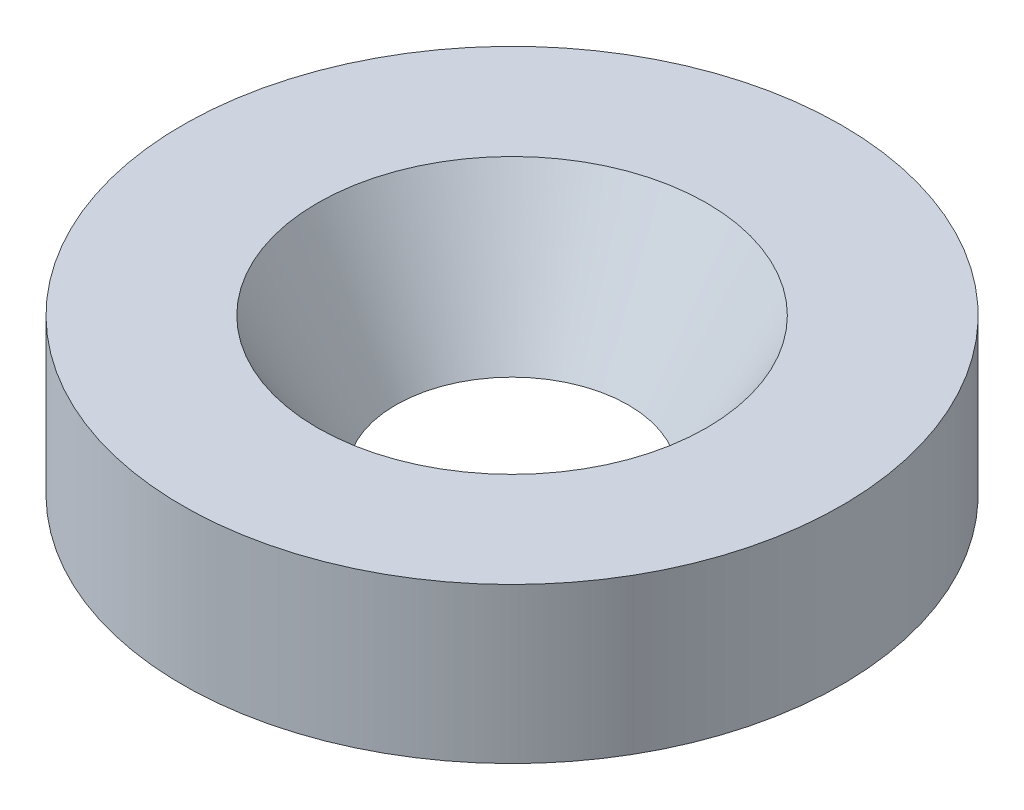
ISO-10303-21;
HEADER;
FILE_DESCRIPTION(('STEP AP214'),'2;1');
FILE_NAME('part.step','',(''),(''),'','','');
FILE_SCHEMA(('AUTOMOTIVE_DESIGN { 1 0 10303 214 1 1 1 1 }'));
ENDSEC;
DATA;
#1=APPLICATION_CONTEXT('core data for automotive mechanical design processes');
#2=APPLICATION_PROTOCOL_DEFINITION('international standard','automotive_design',2000,#1);
#3=PRODUCT_CONTEXT('',#1,'mechanical');
#4=PRODUCT('Part','Part','',(#3));
#5=PRODUCT_RELATED_PRODUCT_CATEGORY('part','',(#4));
#6=PRODUCT_DEFINITION_FORMATION('','',#4);
#7=PRODUCT_DEFINITION_CONTEXT('part definition',#1,'design');
#8=PRODUCT_DEFINITION('design','',#6,#7);
#9=PRODUCT_DEFINITION_SHAPE('','',#8);
#10=(LENGTH_UNIT() NAMED_UNIT(*) SI_UNIT(.MILLI.,.METRE.));
#11=(NAMED_UNIT(*) PLANE_ANGLE_UNIT() SI_UNIT($,.RADIAN.));
#12=(NAMED_UNIT(*) SI_UNIT($,.STERADIAN.) SOLID_ANGLE_UNIT());
#13=UNCERTAINTY_MEASURE_WITH_UNIT(LENGTH_MEASURE(1.E-05),#10,'distance_accuracy_value','');
#14=(GEOMETRIC_REPRESENTATION_CONTEXT(3) GLOBAL_UNCERTAINTY_ASSIGNED_CONTEXT((#13)) GLOBAL_UNIT_ASSIGNED_CONTEXT((#10,
#11,#12)) REPRESENTATION_CONTEXT('',''));
#15=CARTESIAN_POINT('',(0.,0.,0.));
#16=DIRECTION('',(0.,0.,1.));
#17=DIRECTION('',(1.,0.,0.));
#18=AXIS2_PLACEMENT_3D('',#15,#16,#17);
#19=CARTESIAN_POINT('',(0.,4.,-8.5));
#20=DIRECTION('',(0.,1.,0.));
#21=DIRECTION('',(0.,0.,1.));
#22=AXIS2_PLACEMENT_3D('',#19,#20,#21);
#23=PLANE('',#22);
#24=CARTESIAN_POINT('',(0.,4.,0.));
#25=DIRECTION('',(0.,-1.,0.));
#26=DIRECTION('',(0.,0.,-1.));
#27=AXIS2_PLACEMENT_3D('',#24,#25,#26);
#28=CIRCLE('',#27,5.02072594216371);
#29=CARTESIAN_POINT('',(0.,4.,-5.02072594216371));
#30=VERTEX_POINT('',#29);
#31=EDGE_CURVE('E59',#30,#30,#28,.T.);
#32=ORIENTED_EDGE('',*,*,#31,.T.);
#33=EDGE_LOOP('',(#32));
#34=FACE_BOUND('',#33,.T.);
#35=CARTESIAN_POINT('',(0.,4.,0.));
#36=DIRECTION('',(0.,-1.,0.));
#37=DIRECTION('',(0.,0.,-1.));
#38=AXIS2_PLACEMENT_3D('',#35,#36,#37);
#39=CIRCLE('',#38,8.5);
#40=CARTESIAN_POINT('',(0.,4.,-8.5));
#41=VERTEX_POINT('',#40);
#42=EDGE_CURVE('E10',#41,#41,#39,.T.);
#43=ORIENTED_EDGE('',*,*,#42,.F.);
#44=EDGE_LOOP('',(#43));
#45=FACE_BOUND('',#44,.T.);
#46=ADVANCED_FACE('F31',(#34,#45),#23,.T.);
#47=CARTESIAN_POINT('',(0.,0.,0.));
#48=DIRECTION('',(0.,-1.,0.));
#49=DIRECTION('',(0.,0.,-1.));
#50=AXIS2_PLACEMENT_3D('',#47,#48,#49);
#51=CYLINDRICAL_SURFACE('',#50,8.5);
#52=ORIENTED_EDGE('',*,*,#42,.T.);
#53=EDGE_LOOP('',(#52));
#54=FACE_BOUND('',#53,.T.);
#55=CARTESIAN_POINT('',(0.,0.,0.));
#56=DIRECTION('',(0.,-1.,0.));
#57=DIRECTION('',(0.,0.,-1.));
#58=AXIS2_PLACEMENT_3D('',#55,#56,#57);
#59=CIRCLE('',#58,8.5);
#60=CARTESIAN_POINT('',(0.,0.,-8.5));
#61=VERTEX_POINT('',#60);
#62=EDGE_CURVE('E37',#61,#61,#59,.T.);
#63=ORIENTED_EDGE('',*,*,#62,.F.);
#64=EDGE_LOOP('',(#63));
#65=FACE_BOUND('',#64,.T.);
#66=ADVANCED_FACE('F77',(#54,#65),#51,.T.);
#67=CARTESIAN_POINT('',(0.,0.,-8.));
#68=DIRECTION('',(0.,-1.,0.));
#69=DIRECTION('',(0.,0.,-1.));
#70=AXIS2_PLACEMENT_3D('',#67,#68,#69);
#71=PLANE('',#70);
#72=ORIENTED_EDGE('',*,*,#62,.T.);
#73=EDGE_LOOP('',(#72));
#74=FACE_BOUND('',#73,.T.);
#75=CARTESIAN_POINT('',(0.,0.,0.));
#76=DIRECTION('',(0.,-1.,0.));
#77=DIRECTION('',(0.,0.,-1.));
#78=AXIS2_PLACEMENT_3D('',#75,#76,#77);
#79=CIRCLE('',#78,8.);
#80=CARTESIAN_POINT('',(0.,0.,-8.));
#81=VERTEX_POINT('',#80);
#82=EDGE_CURVE('E41',#81,#81,#79,.T.);
#83=ORIENTED_EDGE('',*,*,#82,.F.);
#84=EDGE_LOOP('',(#83));
#85=FACE_BOUND('',#84,.T.);
#86=ADVANCED_FACE('F81',(#74,#85),#71,.T.);
#87=CARTESIAN_POINT('',(0.,0.,0.));
#88=DIRECTION('',(0.,-1.,0.));
#89=DIRECTION('',(0.,0.,-1.));
#90=AXIS2_PLACEMENT_3D('',#87,#88,#89);
#91=CYLINDRICAL_SURFACE('',#90,8.);
#92=ORIENTED_EDGE('',*,*,#82,.T.);
#93=EDGE_LOOP('',(#92));
#94=FACE_BOUND('',#93,.T.);
#95=CARTESIAN_POINT('',(0.,2.75,0.));
#96=DIRECTION('',(0.,-1.,0.));
#97=DIRECTION('',(0.,0.,-1.));
#98=AXIS2_PLACEMENT_3D('',#95,#96,#97);
#99=CIRCLE('',#98,8.);
#100=CARTESIAN_POINT('',(0.,2.75,-8.));
#101=VERTEX_POINT('',#100);
#102=EDGE_CURVE('E45',#101,#101,#99,.T.);
#103=ORIENTED_EDGE('',*,*,#102,.F.);
#104=EDGE_LOOP('',(#103));
#105=FACE_BOUND('',#104,.T.);
#106=ADVANCED_FACE('F85',(#94,#105),#91,.F.);
#107=CARTESIAN_POINT('',(0.,2.75,-6.));
#108=DIRECTION('',(0.,-1.,0.));
#109=DIRECTION('',(0.,0.,-1.));
#110=AXIS2_PLACEMENT_3D('',#107,#108,#109);
#111=PLANE('',#110);
#112=ORIENTED_EDGE('',*,*,#102,.T.);
#113=EDGE_LOOP('',(#112));
#114=FACE_BOUND('',#113,.T.);
#115=CARTESIAN_POINT('',(0.,2.75,0.));
#116=DIRECTION('',(0.,-1.,0.));
#117=DIRECTION('',(0.,0.,-1.));
#118=AXIS2_PLACEMENT_3D('',#115,#116,#117);
#119=CIRCLE('',#118,6.);
#120=CARTESIAN_POINT('',(0.,2.75,-6.));
#121=VERTEX_POINT('',#120);
#122=EDGE_CURVE('E50',#121,#121,#119,.T.);
#123=ORIENTED_EDGE('',*,*,#122,.F.);
#124=EDGE_LOOP('',(#123));
#125=FACE_BOUND('',#124,.T.);
#126=ADVANCED_FACE('F91',(#114,#125),#111,.T.);
#127=CARTESIAN_POINT('',(0.,0.,0.));
#128=DIRECTION('',(0.,-1.,0.));
#129=DIRECTION('',(0.,0.,-1.));
#130=AXIS2_PLACEMENT_3D('',#127,#128,#129);
#131=CYLINDRICAL_SURFACE('',#130,6.);
#132=ORIENTED_EDGE('',*,*,#122,.T.);
#133=EDGE_LOOP('',(#132));
#134=FACE_BOUND('',#133,.T.);
#135=CARTESIAN_POINT('',(0.,0.5,0.));
#136=DIRECTION('',(0.,-1.,0.));
#137=DIRECTION('',(0.,0.,-1.));
#138=AXIS2_PLACEMENT_3D('',#135,#136,#137);
#139=CIRCLE('',#138,6.);
#140=CARTESIAN_POINT('',(0.,0.5,-6.));
#141=VERTEX_POINT('',#140);
#142=EDGE_CURVE('E53',#141,#141,#139,.T.);
#143=ORIENTED_EDGE('',*,*,#142,.F.);
#144=EDGE_LOOP('',(#143));
#145=FACE_BOUND('',#144,.T.);
#146=ADVANCED_FACE('F73',(#134,#145),#131,.T.);
#147=CARTESIAN_POINT('',(0.,0.5,-3.));
#148=DIRECTION('',(0.,-1.,0.));
#149=DIRECTION('',(0.,0.,-1.));
#150=AXIS2_PLACEMENT_3D('',#147,#148,#149);
#151=PLANE('',#150);
#152=ORIENTED_EDGE('',*,*,#142,.T.);
#153=EDGE_LOOP('',(#152));
#154=FACE_BOUND('',#153,.T.);
#155=CARTESIAN_POINT('',(0.,0.5,0.));
#156=DIRECTION('',(0.,-1.,0.));
#157=DIRECTION('',(0.,0.,-1.));
#158=AXIS2_PLACEMENT_3D('',#155,#156,#157);
#159=CIRCLE('',#158,3.);
#160=CARTESIAN_POINT('',(0.,0.5,-3.));
#161=VERTEX_POINT('',#160);
#162=EDGE_CURVE('E56',#161,#161,#159,.T.);
#163=ORIENTED_EDGE('',*,*,#162,.F.);
#164=EDGE_LOOP('',(#163));
#165=FACE_BOUND('',#164,.T.);
#166=ADVANCED_FACE('F67',(#154,#165),#151,.T.);
#167=CARTESIAN_POINT('',(0.,4.,0.));
#168=DIRECTION('',(0.,1.,0.));
#169=DIRECTION('',(0.,0.,1.));
#170=AXIS2_PLACEMENT_3D('',#167,#168,#169);
#171=CONICAL_SURFACE('',#170,5.02072594216371,0.523598775598303);
#172=ORIENTED_EDGE('',*,*,#162,.T.);
#173=EDGE_LOOP('',(#172));
#174=FACE_BOUND('',#173,.T.);
#175=ORIENTED_EDGE('',*,*,#31,.F.);
#176=EDGE_LOOP('',(#175));
#177=FACE_BOUND('',#176,.T.);
#178=ADVANCED_FACE('F65',(#174,#177),#171,.F.);
#179=CLOSED_SHELL('',(#46,#66,#86,#106,#126,#146,#166,#178));
#180=MANIFOLD_SOLID_BREP('B2',#179);
#181=ADVANCED_BREP_SHAPE_REPRESENTATION('',(#18,#180),#14);
#182=SHAPE_DEFINITION_REPRESENTATION(#9,#181);
ENDSEC;
END-ISO-10303-21;
